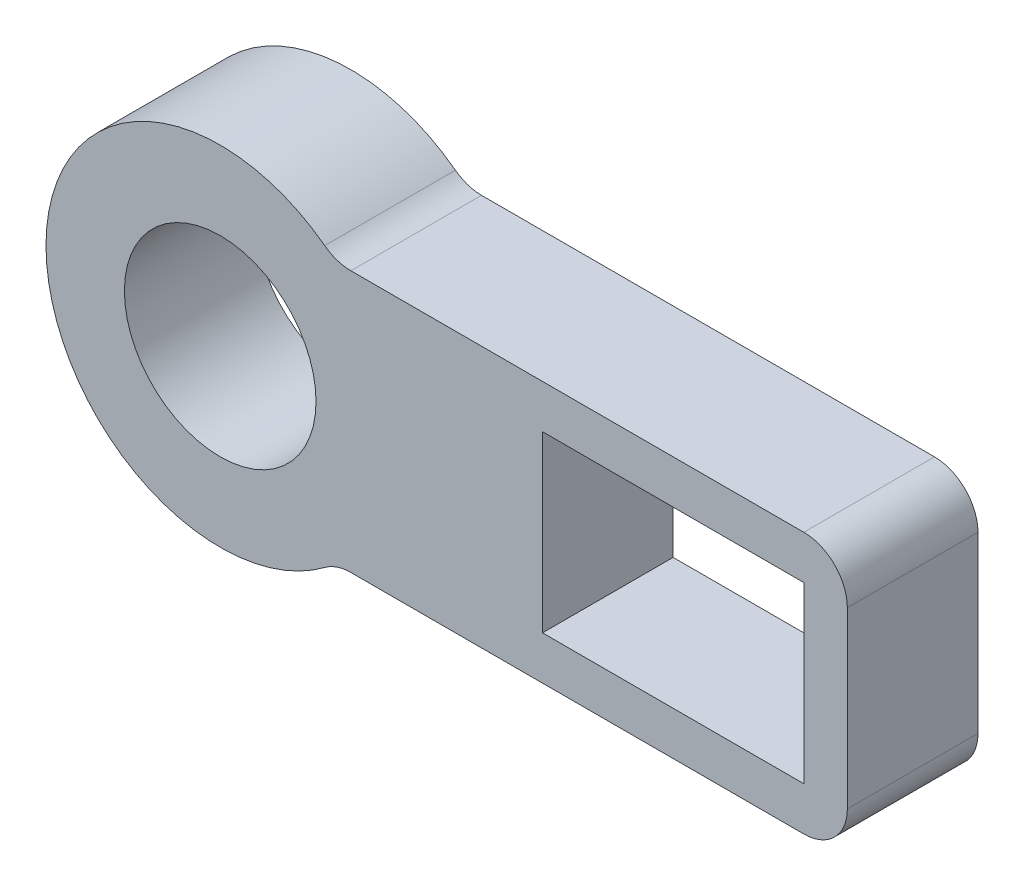
ISO-10303-21;
HEADER;
FILE_DESCRIPTION(('STEP AP214'),'2;1');
FILE_NAME('part.step','',(''),(''),'','','');
FILE_SCHEMA(('AUTOMOTIVE_DESIGN { 1 0 10303 214 1 1 1 1 }'));
ENDSEC;
DATA;
#1=APPLICATION_CONTEXT('core data for automotive mechanical design processes');
#2=APPLICATION_PROTOCOL_DEFINITION('international standard','automotive_design',2000,#1);
#3=PRODUCT_CONTEXT('',#1,'mechanical');
#4=PRODUCT('Part','Part','',(#3));
#5=PRODUCT_RELATED_PRODUCT_CATEGORY('part','',(#4));
#6=PRODUCT_DEFINITION_FORMATION('','',#4);
#7=PRODUCT_DEFINITION_CONTEXT('part definition',#1,'design');
#8=PRODUCT_DEFINITION('design','',#6,#7);
#9=PRODUCT_DEFINITION_SHAPE('','',#8);
#10=(LENGTH_UNIT() NAMED_UNIT(*) SI_UNIT(.MILLI.,.METRE.));
#11=(NAMED_UNIT(*) PLANE_ANGLE_UNIT() SI_UNIT($,.RADIAN.));
#12=(NAMED_UNIT(*) SI_UNIT($,.STERADIAN.) SOLID_ANGLE_UNIT());
#13=UNCERTAINTY_MEASURE_WITH_UNIT(LENGTH_MEASURE(1.E-05),#10,'distance_accuracy_value','');
#14=(GEOMETRIC_REPRESENTATION_CONTEXT(3) GLOBAL_UNCERTAINTY_ASSIGNED_CONTEXT((#13)) GLOBAL_UNIT_ASSIGNED_CONTEXT((#10,
#11,#12)) REPRESENTATION_CONTEXT('',''));
#15=CARTESIAN_POINT('',(0.,0.,0.));
#16=DIRECTION('',(0.,0.,1.));
#17=DIRECTION('',(1.,0.,0.));
#18=AXIS2_PLACEMENT_3D('',#15,#16,#17);
#19=CARTESIAN_POINT('',(0.,0.,1.905));
#20=DIRECTION('',(0.,0.,1.));
#21=DIRECTION('',(1.,0.,0.));
#22=AXIS2_PLACEMENT_3D('',#19,#20,#21);
#23=PLANE('',#22);
#24=DIRECTION('',(1.,0.,0.));
#25=VECTOR('',#24,1.);
#26=CARTESIAN_POINT('',(18.288,-3.81,1.905));
#27=LINE('',#26,#25);
#28=CARTESIAN_POINT('',(3.81,-3.81,1.905));
#29=VERTEX_POINT('',#28);
#30=CARTESIAN_POINT('',(17.018,-3.81,1.905));
#31=VERTEX_POINT('',#30);
#32=EDGE_CURVE('E195',#29,#31,#27,.T.);
#33=ORIENTED_EDGE('',*,*,#32,.T.);
#34=CARTESIAN_POINT('',(17.018,-2.54,1.905));
#35=DIRECTION('',(0.,0.,1.));
#36=DIRECTION('',(1.,0.,0.));
#37=AXIS2_PLACEMENT_3D('',#34,#35,#36);
#38=CIRCLE('',#37,1.27);
#39=CARTESIAN_POINT('',(18.288,-2.54,1.905));
#40=VERTEX_POINT('',#39);
#41=EDGE_CURVE('E61',#31,#40,#38,.T.);
#42=ORIENTED_EDGE('',*,*,#41,.T.);
#43=DIRECTION('',(0.,1.,0.));
#44=VECTOR('',#43,1.);
#45=CARTESIAN_POINT('',(18.288,3.81,1.905));
#46=LINE('',#45,#44);
#47=CARTESIAN_POINT('',(18.288,2.54,1.905));
#48=VERTEX_POINT('',#47);
#49=EDGE_CURVE('E199',#40,#48,#46,.T.);
#50=ORIENTED_EDGE('',*,*,#49,.T.);
#51=CARTESIAN_POINT('',(17.018,2.54,1.905));
#52=DIRECTION('',(0.,0.,1.));
#53=DIRECTION('',(1.,0.,0.));
#54=AXIS2_PLACEMENT_3D('',#51,#52,#53);
#55=CIRCLE('',#54,1.27);
#56=CARTESIAN_POINT('',(17.018,3.81,1.905));
#57=VERTEX_POINT('',#56);
#58=EDGE_CURVE('E252',#48,#57,#55,.T.);
#59=ORIENTED_EDGE('',*,*,#58,.T.);
#60=DIRECTION('',(-1.,0.,0.));
#61=VECTOR('',#60,1.);
#62=CARTESIAN_POINT('',(3.36010416505203,3.81,1.905));
#63=LINE('',#62,#61);
#64=CARTESIAN_POINT('',(3.81,3.81,1.905));
#65=VERTEX_POINT('',#64);
#66=EDGE_CURVE('E202',#57,#65,#63,.T.);
#67=ORIENTED_EDGE('',*,*,#66,.T.);
#68=CARTESIAN_POINT('',(3.81,5.08,1.905));
#69=DIRECTION('',(0.,0.,1.));
#70=DIRECTION('',(1.,0.,0.));
#71=AXIS2_PLACEMENT_3D('',#68,#69,#70);
#72=CIRCLE('',#71,1.27);
#73=CARTESIAN_POINT('',(3.048,4.064,1.905));
#74=VERTEX_POINT('',#73);
#75=EDGE_CURVE('E11',#65,#74,#72,.F.);
#76=ORIENTED_EDGE('',*,*,#75,.T.);
#77=CARTESIAN_POINT('',(0.,0.,1.905));
#78=DIRECTION('',(0.,0.,1.));
#79=DIRECTION('',(1.,0.,0.));
#80=AXIS2_PLACEMENT_3D('',#77,#78,#79);
#81=CIRCLE('',#80,5.08);
#82=CARTESIAN_POINT('',(3.048,-4.064,1.905));
#83=VERTEX_POINT('',#82);
#84=EDGE_CURVE('E191',#74,#83,#81,.T.);
#85=ORIENTED_EDGE('',*,*,#84,.T.);
#86=CARTESIAN_POINT('',(3.81,-5.08,1.905));
#87=DIRECTION('',(0.,0.,1.));
#88=DIRECTION('',(1.,0.,0.));
#89=AXIS2_PLACEMENT_3D('',#86,#87,#88);
#90=CIRCLE('',#89,1.27);
#91=EDGE_CURVE('E260',#83,#29,#90,.F.);
#92=ORIENTED_EDGE('',*,*,#91,.T.);
#93=EDGE_LOOP('',(#33,#42,#50,#59,#67,#76,#85,#92));
#94=FACE_BOUND('',#93,.T.);
#95=CARTESIAN_POINT('',(0.,0.,1.905));
#96=DIRECTION('',(0.,0.,1.));
#97=DIRECTION('',(1.,0.,0.));
#98=AXIS2_PLACEMENT_3D('',#95,#96,#97);
#99=CIRCLE('',#98,2.794);
#100=CARTESIAN_POINT('',(-2.794,0.,1.905));
#101=VERTEX_POINT('',#100);
#102=EDGE_CURVE('E183',#101,#101,#99,.T.);
#103=ORIENTED_EDGE('',*,*,#102,.F.);
#104=EDGE_LOOP('',(#103));
#105=FACE_BOUND('',#104,.T.);
#106=DIRECTION('',(1.,0.,0.));
#107=VECTOR('',#106,1.);
#108=CARTESIAN_POINT('',(9.398,-2.54,1.905));
#109=LINE('',#108,#107);
#110=CARTESIAN_POINT('',(9.398,-2.54,1.905));
#111=VERTEX_POINT('',#110);
#112=CARTESIAN_POINT('',(17.018,-2.54,1.905));
#113=VERTEX_POINT('',#112);
#114=EDGE_CURVE('E141',#111,#113,#109,.T.);
#115=ORIENTED_EDGE('',*,*,#114,.F.);
#116=DIRECTION('',(0.,-1.,0.));
#117=VECTOR('',#116,1.);
#118=CARTESIAN_POINT('',(9.398,2.54,1.905));
#119=LINE('',#118,#117);
#120=CARTESIAN_POINT('',(9.398,2.54,1.905));
#121=VERTEX_POINT('',#120);
#122=EDGE_CURVE('E130',#121,#111,#119,.T.);
#123=ORIENTED_EDGE('',*,*,#122,.F.);
#124=DIRECTION('',(-1.,0.,0.));
#125=VECTOR('',#124,1.);
#126=CARTESIAN_POINT('',(9.398,2.54,1.905));
#127=LINE('',#126,#125);
#128=CARTESIAN_POINT('',(17.018,2.54,1.905));
#129=VERTEX_POINT('',#128);
#130=EDGE_CURVE('E159',#129,#121,#127,.T.);
#131=ORIENTED_EDGE('',*,*,#130,.F.);
#132=DIRECTION('',(0.,1.,0.));
#133=VECTOR('',#132,1.);
#134=CARTESIAN_POINT('',(17.018,2.54,1.905));
#135=LINE('',#134,#133);
#136=EDGE_CURVE('E155',#113,#129,#135,.T.);
#137=ORIENTED_EDGE('',*,*,#136,.F.);
#138=EDGE_LOOP('',(#115,#123,#131,#137));
#139=FACE_BOUND('',#138,.T.);
#140=ADVANCED_FACE('F38',(#94,#105,#139),#23,.T.);
#141=CARTESIAN_POINT('',(0.,0.,-1.905));
#142=DIRECTION('',(0.,0.,1.));
#143=DIRECTION('',(1.,0.,0.));
#144=AXIS2_PLACEMENT_3D('',#141,#142,#143);
#145=PLANE('',#144);
#146=CARTESIAN_POINT('',(0.,0.,-1.905));
#147=DIRECTION('',(0.,0.,1.));
#148=DIRECTION('',(1.,0.,0.));
#149=AXIS2_PLACEMENT_3D('',#146,#147,#148);
#150=CIRCLE('',#149,2.794);
#151=CARTESIAN_POINT('',(-2.794,0.,-1.905));
#152=VERTEX_POINT('',#151);
#153=EDGE_CURVE('E150',#152,#152,#150,.T.);
#154=ORIENTED_EDGE('',*,*,#153,.T.);
#155=EDGE_LOOP('',(#154));
#156=FACE_BOUND('',#155,.T.);
#157=DIRECTION('',(0.,1.,0.));
#158=VECTOR('',#157,1.);
#159=CARTESIAN_POINT('',(18.288,3.81,-1.905));
#160=LINE('',#159,#158);
#161=CARTESIAN_POINT('',(18.288,-2.54,-1.905));
#162=VERTEX_POINT('',#161);
#163=CARTESIAN_POINT('',(18.288,2.54,-1.905));
#164=VERTEX_POINT('',#163);
#165=EDGE_CURVE('E214',#162,#164,#160,.T.);
#166=ORIENTED_EDGE('',*,*,#165,.F.);
#167=CARTESIAN_POINT('',(17.018,-2.54,-1.905));
#168=DIRECTION('',(0.,0.,1.));
#169=DIRECTION('',(1.,0.,0.));
#170=AXIS2_PLACEMENT_3D('',#167,#168,#169);
#171=CIRCLE('',#170,1.27);
#172=CARTESIAN_POINT('',(17.018,-3.81,-1.905));
#173=VERTEX_POINT('',#172);
#174=EDGE_CURVE('E249',#162,#173,#171,.F.);
#175=ORIENTED_EDGE('',*,*,#174,.T.);
#176=DIRECTION('',(1.,0.,0.));
#177=VECTOR('',#176,1.);
#178=CARTESIAN_POINT('',(18.288,-3.81,-1.905));
#179=LINE('',#178,#177);
#180=CARTESIAN_POINT('',(3.81,-3.81,-1.905));
#181=VERTEX_POINT('',#180);
#182=EDGE_CURVE('E210',#181,#173,#179,.T.);
#183=ORIENTED_EDGE('',*,*,#182,.F.);
#184=CARTESIAN_POINT('',(3.81,-5.08,-1.905));
#185=DIRECTION('',(0.,0.,1.));
#186=DIRECTION('',(1.,0.,0.));
#187=AXIS2_PLACEMENT_3D('',#184,#185,#186);
#188=CIRCLE('',#187,1.27);
#189=CARTESIAN_POINT('',(3.048,-4.064,-1.905));
#190=VERTEX_POINT('',#189);
#191=EDGE_CURVE('E257',#181,#190,#188,.T.);
#192=ORIENTED_EDGE('',*,*,#191,.T.);
#193=CARTESIAN_POINT('',(0.,0.,-1.905));
#194=DIRECTION('',(0.,0.,1.));
#195=DIRECTION('',(1.,0.,0.));
#196=AXIS2_PLACEMENT_3D('',#193,#194,#195);
#197=CIRCLE('',#196,5.08);
#198=CARTESIAN_POINT('',(3.048,4.064,-1.905));
#199=VERTEX_POINT('',#198);
#200=EDGE_CURVE('E187',#199,#190,#197,.T.);
#201=ORIENTED_EDGE('',*,*,#200,.F.);
#202=CARTESIAN_POINT('',(3.81,5.08,-1.905));
#203=DIRECTION('',(0.,0.,1.));
#204=DIRECTION('',(1.,0.,0.));
#205=AXIS2_PLACEMENT_3D('',#202,#203,#204);
#206=CIRCLE('',#205,1.27);
#207=CARTESIAN_POINT('',(3.81,3.81,-1.905));
#208=VERTEX_POINT('',#207);
#209=EDGE_CURVE('E47',#199,#208,#206,.T.);
#210=ORIENTED_EDGE('',*,*,#209,.T.);
#211=DIRECTION('',(-1.,0.,0.));
#212=VECTOR('',#211,1.);
#213=CARTESIAN_POINT('',(3.36010416505203,3.81,-1.905));
#214=LINE('',#213,#212);
#215=CARTESIAN_POINT('',(17.018,3.81,-1.905));
#216=VERTEX_POINT('',#215);
#217=EDGE_CURVE('E196',#216,#208,#214,.T.);
#218=ORIENTED_EDGE('',*,*,#217,.F.);
#219=CARTESIAN_POINT('',(17.018,2.54,-1.905));
#220=DIRECTION('',(0.,0.,1.));
#221=DIRECTION('',(1.,0.,0.));
#222=AXIS2_PLACEMENT_3D('',#219,#220,#221);
#223=CIRCLE('',#222,1.27);
#224=EDGE_CURVE('E246',#216,#164,#223,.F.);
#225=ORIENTED_EDGE('',*,*,#224,.T.);
#226=EDGE_LOOP('',(#166,#175,#183,#192,#201,#210,#218,#225));
#227=FACE_BOUND('',#226,.T.);
#228=DIRECTION('',(0.,-1.,0.));
#229=VECTOR('',#228,1.);
#230=CARTESIAN_POINT('',(9.398,2.54,-1.905));
#231=LINE('',#230,#229);
#232=CARTESIAN_POINT('',(9.398,2.54,-1.905));
#233=VERTEX_POINT('',#232);
#234=CARTESIAN_POINT('',(9.398,-2.54,-1.905));
#235=VERTEX_POINT('',#234);
#236=EDGE_CURVE('E164',#233,#235,#231,.T.);
#237=ORIENTED_EDGE('',*,*,#236,.T.);
#238=DIRECTION('',(1.,0.,0.));
#239=VECTOR('',#238,1.);
#240=CARTESIAN_POINT('',(9.398,-2.54,-1.905));
#241=LINE('',#240,#239);
#242=CARTESIAN_POINT('',(17.018,-2.54,-1.905));
#243=VERTEX_POINT('',#242);
#244=EDGE_CURVE('E148',#235,#243,#241,.T.);
#245=ORIENTED_EDGE('',*,*,#244,.T.);
#246=DIRECTION('',(0.,1.,0.));
#247=VECTOR('',#246,1.);
#248=CARTESIAN_POINT('',(17.018,2.54,-1.905));
#249=LINE('',#248,#247);
#250=CARTESIAN_POINT('',(17.018,2.54,-1.905));
#251=VERTEX_POINT('',#250);
#252=EDGE_CURVE('E169',#243,#251,#249,.T.);
#253=ORIENTED_EDGE('',*,*,#252,.T.);
#254=DIRECTION('',(-1.,0.,0.));
#255=VECTOR('',#254,1.);
#256=CARTESIAN_POINT('',(9.398,2.54,-1.905));
#257=LINE('',#256,#255);
#258=EDGE_CURVE('E142',#251,#233,#257,.T.);
#259=ORIENTED_EDGE('',*,*,#258,.T.);
#260=EDGE_LOOP('',(#237,#245,#253,#259));
#261=FACE_BOUND('',#260,.T.);
#262=ADVANCED_FACE('F267',(#156,#227,#261),#145,.F.);
#263=CARTESIAN_POINT('',(0.,0.,1.905));
#264=DIRECTION('',(0.,0.,-1.));
#265=DIRECTION('',(-1.,0.,0.));
#266=AXIS2_PLACEMENT_3D('',#263,#264,#265);
#267=CYLINDRICAL_SURFACE('',#266,5.08);
#268=ORIENTED_EDGE('',*,*,#200,.T.);
#269=DIRECTION('',(0.,0.,-1.));
#270=VECTOR('',#269,1.);
#271=CARTESIAN_POINT('',(3.048,-4.064,1.905));
#272=LINE('',#271,#270);
#273=EDGE_CURVE('E230',#190,#83,#272,.F.);
#274=ORIENTED_EDGE('',*,*,#273,.T.);
#275=ORIENTED_EDGE('',*,*,#84,.F.);
#276=DIRECTION('',(0.,0.,-1.));
#277=VECTOR('',#276,1.);
#278=CARTESIAN_POINT('',(3.048,4.064,1.905));
#279=LINE('',#278,#277);
#280=EDGE_CURVE('E226',#74,#199,#279,.T.);
#281=ORIENTED_EDGE('',*,*,#280,.T.);
#282=EDGE_LOOP('',(#268,#274,#275,#281));
#283=FACE_BOUND('',#282,.T.);
#284=ADVANCED_FACE('F282',(#283),#267,.T.);
#285=CARTESIAN_POINT('',(18.288,-3.81,1.905));
#286=DIRECTION('',(0.,1.,0.));
#287=DIRECTION('',(-1.,0.,0.));
#288=AXIS2_PLACEMENT_3D('',#285,#286,#287);
#289=PLANE('',#288);
#290=ORIENTED_EDGE('',*,*,#32,.F.);
#291=DIRECTION('',(0.,0.,1.));
#292=VECTOR('',#291,1.);
#293=CARTESIAN_POINT('',(3.81,-3.81,-1.905));
#294=LINE('',#293,#292);
#295=EDGE_CURVE('E222',#29,#181,#294,.F.);
#296=ORIENTED_EDGE('',*,*,#295,.T.);
#297=ORIENTED_EDGE('',*,*,#182,.T.);
#298=DIRECTION('',(0.,0.,-1.));
#299=VECTOR('',#298,1.);
#300=CARTESIAN_POINT('',(17.018,-3.81,1.905));
#301=LINE('',#300,#299);
#302=EDGE_CURVE('E206',#173,#31,#301,.F.);
#303=ORIENTED_EDGE('',*,*,#302,.T.);
#304=EDGE_LOOP('',(#290,#296,#297,#303));
#305=FACE_BOUND('',#304,.T.);
#306=ADVANCED_FACE('F289',(#305),#289,.F.);
#307=CARTESIAN_POINT('',(18.288,3.81,1.905));
#308=DIRECTION('',(-1.,0.,0.));
#309=DIRECTION('',(0.,-1.,0.));
#310=AXIS2_PLACEMENT_3D('',#307,#308,#309);
#311=PLANE('',#310);
#312=ORIENTED_EDGE('',*,*,#49,.F.);
#313=DIRECTION('',(0.,0.,-1.));
#314=VECTOR('',#313,1.);
#315=CARTESIAN_POINT('',(18.288,-2.54,1.905));
#316=LINE('',#315,#314);
#317=EDGE_CURVE('E242',#40,#162,#316,.T.);
#318=ORIENTED_EDGE('',*,*,#317,.T.);
#319=ORIENTED_EDGE('',*,*,#165,.T.);
#320=DIRECTION('',(0.,0.,-1.));
#321=VECTOR('',#320,1.);
#322=CARTESIAN_POINT('',(18.288,2.54,1.905));
#323=LINE('',#322,#321);
#324=EDGE_CURVE('E54',#164,#48,#323,.F.);
#325=ORIENTED_EDGE('',*,*,#324,.T.);
#326=EDGE_LOOP('',(#312,#318,#319,#325));
#327=FACE_BOUND('',#326,.T.);
#328=ADVANCED_FACE('F295',(#327),#311,.F.);
#329=CARTESIAN_POINT('',(3.36010416505203,3.81,1.905));
#330=DIRECTION('',(0.,-1.,0.));
#331=DIRECTION('',(1.,0.,0.));
#332=AXIS2_PLACEMENT_3D('',#329,#330,#331);
#333=PLANE('',#332);
#334=ORIENTED_EDGE('',*,*,#217,.T.);
#335=DIRECTION('',(0.,0.,1.));
#336=VECTOR('',#335,1.);
#337=CARTESIAN_POINT('',(3.81,3.81,1.905));
#338=LINE('',#337,#336);
#339=EDGE_CURVE('E237',#208,#65,#338,.T.);
#340=ORIENTED_EDGE('',*,*,#339,.T.);
#341=ORIENTED_EDGE('',*,*,#66,.F.);
#342=DIRECTION('',(0.,0.,-1.));
#343=VECTOR('',#342,1.);
#344=CARTESIAN_POINT('',(17.018,3.81,1.905));
#345=LINE('',#344,#343);
#346=EDGE_CURVE('E233',#57,#216,#345,.T.);
#347=ORIENTED_EDGE('',*,*,#346,.T.);
#348=EDGE_LOOP('',(#334,#340,#341,#347));
#349=FACE_BOUND('',#348,.T.);
#350=ADVANCED_FACE('F273',(#349),#333,.F.);
#351=CARTESIAN_POINT('',(0.,0.,1.905));
#352=DIRECTION('',(0.,0.,-1.));
#353=DIRECTION('',(-1.,0.,0.));
#354=AXIS2_PLACEMENT_3D('',#351,#352,#353);
#355=CYLINDRICAL_SURFACE('',#354,2.794);
#356=CARTESIAN_POINT('',(-2.794,0.,1.905));
#357=CARTESIAN_POINT('',(-2.794,0.,1.8653125));
#358=CARTESIAN_POINT('',(-2.794,0.,1.825625));
#359=CARTESIAN_POINT('',(-2.794,0.,1.74625));
#360=CARTESIAN_POINT('',(-2.794,0.,1.7065625));
#361=CARTESIAN_POINT('',(-2.794,0.,1.6271875));
#362=CARTESIAN_POINT('',(-2.794,0.,1.5875));
#363=CARTESIAN_POINT('',(-2.794,0.,1.508125));
#364=CARTESIAN_POINT('',(-2.794,0.,1.4684375));
#365=CARTESIAN_POINT('',(-2.794,0.,1.3890625));
#366=CARTESIAN_POINT('',(-2.794,0.,1.349375));
#367=CARTESIAN_POINT('',(-2.794,0.,1.27));
#368=CARTESIAN_POINT('',(-2.794,0.,1.2303125));
#369=CARTESIAN_POINT('',(-2.794,0.,1.1509375));
#370=CARTESIAN_POINT('',(-2.794,0.,1.11125));
#371=CARTESIAN_POINT('',(-2.794,0.,1.031875));
#372=CARTESIAN_POINT('',(-2.794,0.,0.9921875));
#373=CARTESIAN_POINT('',(-2.794,0.,0.9128125));
#374=CARTESIAN_POINT('',(-2.794,0.,0.873125));
#375=CARTESIAN_POINT('',(-2.794,0.,0.79375));
#376=CARTESIAN_POINT('',(-2.794,0.,0.7540625));
#377=CARTESIAN_POINT('',(-2.794,0.,0.6746875));
#378=CARTESIAN_POINT('',(-2.794,0.,0.635));
#379=CARTESIAN_POINT('',(-2.794,0.,0.555625));
#380=CARTESIAN_POINT('',(-2.794,0.,0.5159375));
#381=CARTESIAN_POINT('',(-2.794,0.,0.4365625));
#382=CARTESIAN_POINT('',(-2.794,0.,0.396875));
#383=CARTESIAN_POINT('',(-2.794,0.,0.3175));
#384=CARTESIAN_POINT('',(-2.794,0.,0.2778125));
#385=CARTESIAN_POINT('',(-2.794,0.,0.1984375));
#386=CARTESIAN_POINT('',(-2.794,0.,0.15875));
#387=CARTESIAN_POINT('',(-2.794,0.,0.0793749999999998));
#388=CARTESIAN_POINT('',(-2.794,0.,0.0396874999999998));
#389=CARTESIAN_POINT('',(-2.794,0.,-0.0396875));
#390=CARTESIAN_POINT('',(-2.794,0.,-0.0793749999999998));
#391=CARTESIAN_POINT('',(-2.794,0.,-0.15875));
#392=CARTESIAN_POINT('',(-2.794,0.,-0.1984375));
#393=CARTESIAN_POINT('',(-2.794,0.,-0.2778125));
#394=CARTESIAN_POINT('',(-2.794,0.,-0.3175));
#395=CARTESIAN_POINT('',(-2.794,0.,-0.396875));
#396=CARTESIAN_POINT('',(-2.794,0.,-0.4365625));
#397=CARTESIAN_POINT('',(-2.794,0.,-0.5159375));
#398=CARTESIAN_POINT('',(-2.794,0.,-0.555625));
#399=CARTESIAN_POINT('',(-2.794,0.,-0.635));
#400=CARTESIAN_POINT('',(-2.794,0.,-0.6746875));
#401=CARTESIAN_POINT('',(-2.794,0.,-0.7540625));
#402=CARTESIAN_POINT('',(-2.794,0.,-0.79375));
#403=CARTESIAN_POINT('',(-2.794,0.,-0.873125));
#404=CARTESIAN_POINT('',(-2.794,0.,-0.9128125));
#405=CARTESIAN_POINT('',(-2.794,0.,-0.9921875));
#406=CARTESIAN_POINT('',(-2.794,0.,-1.031875));
#407=CARTESIAN_POINT('',(-2.794,0.,-1.11125));
#408=CARTESIAN_POINT('',(-2.794,0.,-1.1509375));
#409=CARTESIAN_POINT('',(-2.794,0.,-1.2303125));
#410=CARTESIAN_POINT('',(-2.794,0.,-1.27));
#411=CARTESIAN_POINT('',(-2.794,0.,-1.349375));
#412=CARTESIAN_POINT('',(-2.794,0.,-1.3890625));
#413=CARTESIAN_POINT('',(-2.794,0.,-1.4684375));
#414=CARTESIAN_POINT('',(-2.794,0.,-1.508125));
#415=CARTESIAN_POINT('',(-2.794,0.,-1.5875));
#416=CARTESIAN_POINT('',(-2.794,0.,-1.6271875));
#417=CARTESIAN_POINT('',(-2.794,0.,-1.7065625));
#418=CARTESIAN_POINT('',(-2.794,0.,-1.74625));
#419=CARTESIAN_POINT('',(-2.794,0.,-1.825625));
#420=CARTESIAN_POINT('',(-2.794,0.,-1.8653125));
#421=CARTESIAN_POINT('',(-2.794,0.,-1.905));
#422=B_SPLINE_CURVE_WITH_KNOTS('',3,(#356,#357,#358,#359,#360,#361,#362,#363,#364,#365,#366,
#367,#368,#369,#370,#371,#372,#373,#374,#375,#376,#377,#378,#379,#380,#381,#382,#383,#384,#385,
#386,#387,#388,#389,#390,#391,#392,#393,#394,#395,#396,#397,#398,#399,#400,#401,#402,#403,#404,
#405,#406,#407,#408,#409,#410,#411,#412,#413,#414,#415,#416,#417,#418,#419,#420,#421),
.UNSPECIFIED.,.F.,.F.,(4,2,2,2,2,2,2,2,2,2,2,2,2,2,2,2,2,2,2,2,2,2,2,2,2,2,2,2,2,2,2,2,4),(0.,
0.1190625,0.238125,0.3571875,0.47625,0.5953125,0.714375,0.8334375,0.9525,1.0715625,1.190625,
1.3096875,1.42875,1.5478125,1.666875,1.7859375,1.905,2.0240625,2.143125,2.2621875,2.38125,
2.5003125,2.619375,2.7384375,2.8575,2.9765625,3.095625,3.2146875,3.33375,3.4528125,3.571875,
3.6909375,3.81),.UNSPECIFIED.);
#423=EDGE_CURVE('BSEAM310',#101,#152,#422,.T.);
#424=ORIENTED_EDGE('',*,*,#102,.T.);
#425=ORIENTED_EDGE('',*,*,#153,.F.);
#426=ORIENTED_EDGE('',*,*,#423,.T.);
#427=ORIENTED_EDGE('',*,*,#423,.F.);
#428=EDGE_LOOP('',(#424,#426,#425,#427));
#429=FACE_BOUND('',#428,.T.);
#430=ADVANCED_FACE('F310',(#429),#355,.F.);
#431=CARTESIAN_POINT('',(9.398,2.54,1.905));
#432=DIRECTION('',(1.,0.,0.));
#433=DIRECTION('',(0.,0.,-1.));
#434=AXIS2_PLACEMENT_3D('',#431,#432,#433);
#435=PLANE('',#434);
#436=ORIENTED_EDGE('',*,*,#236,.F.);
#437=DIRECTION('',(0.,0.,-1.));
#438=VECTOR('',#437,1.);
#439=CARTESIAN_POINT('',(9.398,2.54,1.905));
#440=LINE('',#439,#438);
#441=EDGE_CURVE('E136',#121,#233,#440,.T.);
#442=ORIENTED_EDGE('',*,*,#441,.F.);
#443=ORIENTED_EDGE('',*,*,#122,.T.);
#444=DIRECTION('',(0.,0.,-1.));
#445=VECTOR('',#444,1.);
#446=CARTESIAN_POINT('',(9.398,-2.54,1.905));
#447=LINE('',#446,#445);
#448=EDGE_CURVE('E133',#111,#235,#447,.T.);
#449=ORIENTED_EDGE('',*,*,#448,.T.);
#450=EDGE_LOOP('',(#436,#442,#443,#449));
#451=FACE_BOUND('',#450,.T.);
#452=ADVANCED_FACE('F132',(#451),#435,.T.);
#453=CARTESIAN_POINT('',(9.398,-2.54,1.905));
#454=DIRECTION('',(0.,1.,0.));
#455=DIRECTION('',(-1.,0.,0.));
#456=AXIS2_PLACEMENT_3D('',#453,#454,#455);
#457=PLANE('',#456);
#458=ORIENTED_EDGE('',*,*,#244,.F.);
#459=ORIENTED_EDGE('',*,*,#448,.F.);
#460=ORIENTED_EDGE('',*,*,#114,.T.);
#461=DIRECTION('',(0.,0.,-1.));
#462=VECTOR('',#461,1.);
#463=CARTESIAN_POINT('',(17.018,-2.54,1.905));
#464=LINE('',#463,#462);
#465=EDGE_CURVE('E151',#113,#243,#464,.T.);
#466=ORIENTED_EDGE('',*,*,#465,.T.);
#467=EDGE_LOOP('',(#458,#459,#460,#466));
#468=FACE_BOUND('',#467,.T.);
#469=ADVANCED_FACE('F145',(#468),#457,.T.);
#470=CARTESIAN_POINT('',(17.018,2.54,1.905));
#471=DIRECTION('',(-1.,0.,0.));
#472=DIRECTION('',(0.,0.,1.));
#473=AXIS2_PLACEMENT_3D('',#470,#471,#472);
#474=PLANE('',#473);
#475=ORIENTED_EDGE('',*,*,#252,.F.);
#476=ORIENTED_EDGE('',*,*,#465,.F.);
#477=ORIENTED_EDGE('',*,*,#136,.T.);
#478=DIRECTION('',(0.,0.,-1.));
#479=VECTOR('',#478,1.);
#480=CARTESIAN_POINT('',(17.018,2.54,1.905));
#481=LINE('',#480,#479);
#482=EDGE_CURVE('E178',#129,#251,#481,.T.);
#483=ORIENTED_EDGE('',*,*,#482,.T.);
#484=EDGE_LOOP('',(#475,#476,#477,#483));
#485=FACE_BOUND('',#484,.T.);
#486=ADVANCED_FACE('F354',(#485),#474,.T.);
#487=CARTESIAN_POINT('',(9.398,2.54,1.905));
#488=DIRECTION('',(0.,-1.,0.));
#489=DIRECTION('',(1.,0.,0.));
#490=AXIS2_PLACEMENT_3D('',#487,#488,#489);
#491=PLANE('',#490);
#492=ORIENTED_EDGE('',*,*,#258,.F.);
#493=ORIENTED_EDGE('',*,*,#482,.F.);
#494=ORIENTED_EDGE('',*,*,#130,.T.);
#495=ORIENTED_EDGE('',*,*,#441,.T.);
#496=EDGE_LOOP('',(#492,#493,#494,#495));
#497=FACE_BOUND('',#496,.T.);
#498=ADVANCED_FACE('F323',(#497),#491,.T.);
#499=CARTESIAN_POINT('',(3.81,-5.08,1.905));
#500=DIRECTION('',(0.,0.,-1.));
#501=DIRECTION('',(-1.,0.,0.));
#502=AXIS2_PLACEMENT_3D('',#499,#500,#501);
#503=CYLINDRICAL_SURFACE('',#502,1.27);
#504=ORIENTED_EDGE('',*,*,#91,.F.);
#505=ORIENTED_EDGE('',*,*,#273,.F.);
#506=ORIENTED_EDGE('',*,*,#191,.F.);
#507=ORIENTED_EDGE('',*,*,#295,.F.);
#508=EDGE_LOOP('',(#504,#505,#506,#507));
#509=FACE_BOUND('',#508,.T.);
#510=ADVANCED_FACE('F285',(#509),#503,.F.);
#511=CARTESIAN_POINT('',(3.81,5.08,1.905));
#512=DIRECTION('',(0.,0.,-1.));
#513=DIRECTION('',(-1.,0.,0.));
#514=AXIS2_PLACEMENT_3D('',#511,#512,#513);
#515=CYLINDRICAL_SURFACE('',#514,1.27);
#516=ORIENTED_EDGE('',*,*,#75,.F.);
#517=ORIENTED_EDGE('',*,*,#339,.F.);
#518=ORIENTED_EDGE('',*,*,#209,.F.);
#519=ORIENTED_EDGE('',*,*,#280,.F.);
#520=EDGE_LOOP('',(#516,#517,#518,#519));
#521=FACE_BOUND('',#520,.T.);
#522=ADVANCED_FACE('F277',(#521),#515,.F.);
#523=CARTESIAN_POINT('',(17.018,-2.54,1.905));
#524=DIRECTION('',(0.,0.,-1.));
#525=DIRECTION('',(-1.,0.,0.));
#526=AXIS2_PLACEMENT_3D('',#523,#524,#525);
#527=CYLINDRICAL_SURFACE('',#526,1.27);
#528=ORIENTED_EDGE('',*,*,#41,.F.);
#529=ORIENTED_EDGE('',*,*,#302,.F.);
#530=ORIENTED_EDGE('',*,*,#174,.F.);
#531=ORIENTED_EDGE('',*,*,#317,.F.);
#532=EDGE_LOOP('',(#528,#529,#530,#531));
#533=FACE_BOUND('',#532,.T.);
#534=ADVANCED_FACE('F293',(#533),#527,.T.);
#535=CARTESIAN_POINT('',(17.018,2.54,1.905));
#536=DIRECTION('',(0.,0.,-1.));
#537=DIRECTION('',(-1.,0.,0.));
#538=AXIS2_PLACEMENT_3D('',#535,#536,#537);
#539=CYLINDRICAL_SURFACE('',#538,1.27);
#540=ORIENTED_EDGE('',*,*,#58,.F.);
#541=ORIENTED_EDGE('',*,*,#324,.F.);
#542=ORIENTED_EDGE('',*,*,#224,.F.);
#543=ORIENTED_EDGE('',*,*,#346,.F.);
#544=EDGE_LOOP('',(#540,#541,#542,#543));
#545=FACE_BOUND('',#544,.T.);
#546=ADVANCED_FACE('F40',(#545),#539,.T.);
#547=CLOSED_SHELL('',(#140,#262,#284,#306,#328,#350,#430,#452,#469,#486,#498,#510,#522,#534,#546));
#548=MANIFOLD_SOLID_BREP('B2',#547);
#549=ADVANCED_BREP_SHAPE_REPRESENTATION('',(#18,#548),#14);
#550=SHAPE_DEFINITION_REPRESENTATION(#9,#549);
ENDSEC;
END-ISO-10303-21;
